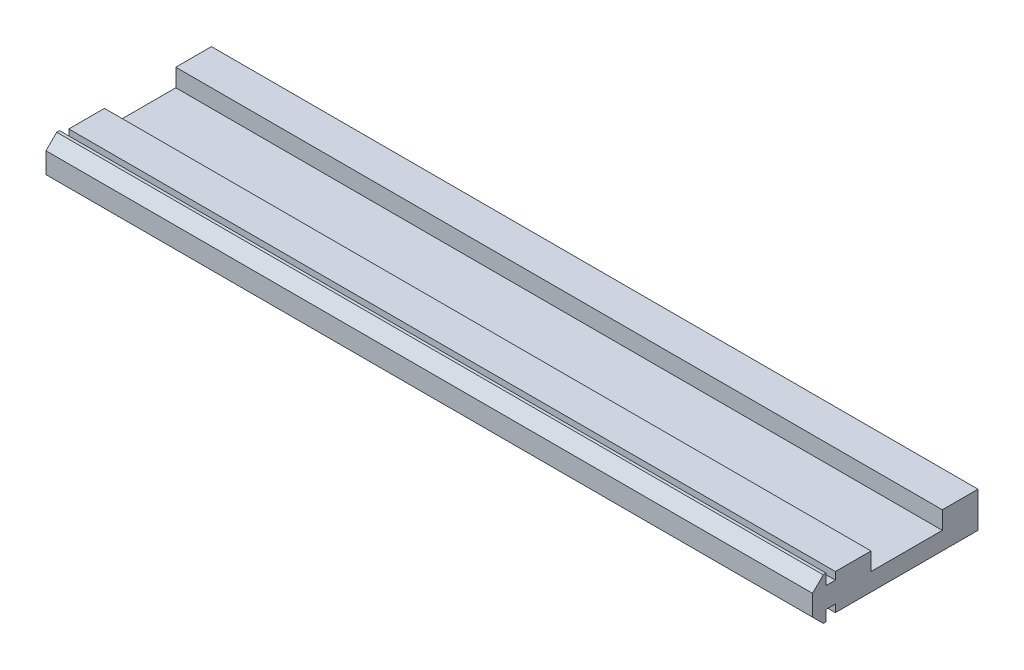
ISO-10303-21;
HEADER;
FILE_DESCRIPTION(('STEP AP214'),'2;1');
FILE_NAME('part.step','',(''),(''),'','','');
FILE_SCHEMA(('AUTOMOTIVE_DESIGN { 1 0 10303 214 1 1 1 1 }'));
ENDSEC;
DATA;
#1=APPLICATION_CONTEXT('core data for automotive mechanical design processes');
#2=APPLICATION_PROTOCOL_DEFINITION('international standard','automotive_design',2000,#1);
#3=PRODUCT_CONTEXT('',#1,'mechanical');
#4=PRODUCT('Part','Part','',(#3));
#5=PRODUCT_RELATED_PRODUCT_CATEGORY('part','',(#4));
#6=PRODUCT_DEFINITION_FORMATION('','',#4);
#7=PRODUCT_DEFINITION_CONTEXT('part definition',#1,'design');
#8=PRODUCT_DEFINITION('design','',#6,#7);
#9=PRODUCT_DEFINITION_SHAPE('','',#8);
#10=(LENGTH_UNIT() NAMED_UNIT(*) SI_UNIT(.MILLI.,.METRE.));
#11=(NAMED_UNIT(*) PLANE_ANGLE_UNIT() SI_UNIT($,.RADIAN.));
#12=(NAMED_UNIT(*) SI_UNIT($,.STERADIAN.) SOLID_ANGLE_UNIT());
#13=UNCERTAINTY_MEASURE_WITH_UNIT(LENGTH_MEASURE(1.E-05),#10,'distance_accuracy_value','');
#14=(GEOMETRIC_REPRESENTATION_CONTEXT(3) GLOBAL_UNCERTAINTY_ASSIGNED_CONTEXT((#13)) GLOBAL_UNIT_ASSIGNED_CONTEXT((#10,
#11,#12)) REPRESENTATION_CONTEXT('',''));
#15=CARTESIAN_POINT('',(0.,0.,0.));
#16=DIRECTION('',(0.,0.,1.));
#17=DIRECTION('',(1.,0.,0.));
#18=AXIS2_PLACEMENT_3D('',#15,#16,#17);
#19=CARTESIAN_POINT('',(925.,0.,90.1082240909334));
#20=DIRECTION('',(0.,0.,-1.));
#21=DIRECTION('',(-1.,0.,0.));
#22=AXIS2_PLACEMENT_3D('',#19,#20,#21);
#23=PLANE('',#22);
#24=DIRECTION('',(-1.,0.,0.));
#25=VECTOR('',#24,1.);
#26=CARTESIAN_POINT('',(925.,-5.00000000000001,90.1082240909334));
#27=LINE('',#26,#25);
#28=CARTESIAN_POINT('',(925.,-5.00000000000001,90.1082240909334));
#29=VERTEX_POINT('',#28);
#30=CARTESIAN_POINT('',(710.,-5.00000000000001,90.1082240909334));
#31=VERTEX_POINT('',#30);
#32=EDGE_CURVE('E245',#29,#31,#27,.T.);
#33=ORIENTED_EDGE('',*,*,#32,.T.);
#34=DIRECTION('',(0.,1.,0.));
#35=VECTOR('',#34,1.);
#36=CARTESIAN_POINT('',(710.,0.,90.1082240909334));
#37=LINE('',#36,#35);
#38=CARTESIAN_POINT('',(710.,4.99999999999999,90.1082240909334));
#39=VERTEX_POINT('',#38);
#40=EDGE_CURVE('E202',#31,#39,#37,.T.);
#41=ORIENTED_EDGE('',*,*,#40,.T.);
#42=DIRECTION('',(-1.,0.,0.));
#43=VECTOR('',#42,1.);
#44=CARTESIAN_POINT('',(925.,4.99999999999999,90.1082240909334));
#45=LINE('',#44,#43);
#46=CARTESIAN_POINT('',(925.,4.99999999999999,90.1082240909334));
#47=VERTEX_POINT('',#46);
#48=EDGE_CURVE('E50',#47,#39,#45,.T.);
#49=ORIENTED_EDGE('',*,*,#48,.F.);
#50=DIRECTION('',(0.,-1.,0.));
#51=VECTOR('',#50,1.);
#52=CARTESIAN_POINT('',(925.,0.,90.1082240909334));
#53=LINE('',#52,#51);
#54=EDGE_CURVE('E221',#47,#29,#53,.T.);
#55=ORIENTED_EDGE('',*,*,#54,.T.);
#56=EDGE_LOOP('',(#33,#41,#49,#55));
#57=FACE_BOUND('',#56,.T.);
#58=ADVANCED_FACE('F43',(#57),#23,.T.);
#59=CARTESIAN_POINT('',(925.,4.99999999999999,0.));
#60=DIRECTION('',(0.,1.,0.));
#61=DIRECTION('',(0.,0.,1.));
#62=AXIS2_PLACEMENT_3D('',#59,#60,#61);
#63=PLANE('',#62);
#64=ORIENTED_EDGE('',*,*,#48,.T.);
#65=DIRECTION('',(0.,0.,1.));
#66=VECTOR('',#65,1.);
#67=CARTESIAN_POINT('',(710.,4.99999999999999,0.));
#68=LINE('',#67,#66);
#69=CARTESIAN_POINT('',(710.,4.99999999999999,100.108224090933));
#70=VERTEX_POINT('',#69);
#71=EDGE_CURVE('E218',#39,#70,#68,.T.);
#72=ORIENTED_EDGE('',*,*,#71,.T.);
#73=DIRECTION('',(-1.,0.,0.));
#74=VECTOR('',#73,1.);
#75=CARTESIAN_POINT('',(925.,4.99999999999999,100.108224090933));
#76=LINE('',#75,#74);
#77=CARTESIAN_POINT('',(925.,4.99999999999999,100.108224090933));
#78=VERTEX_POINT('',#77);
#79=EDGE_CURVE('E263',#78,#70,#76,.T.);
#80=ORIENTED_EDGE('',*,*,#79,.F.);
#81=DIRECTION('',(0.,0.,-1.));
#82=VECTOR('',#81,1.);
#83=CARTESIAN_POINT('',(925.,4.99999999999999,0.));
#84=LINE('',#83,#82);
#85=EDGE_CURVE('E224',#78,#47,#84,.T.);
#86=ORIENTED_EDGE('',*,*,#85,.T.);
#87=EDGE_LOOP('',(#64,#72,#80,#86));
#88=FACE_BOUND('',#87,.T.);
#89=ADVANCED_FACE('F267',(#88),#63,.T.);
#90=CARTESIAN_POINT('',(925.,0.,100.108224090933));
#91=DIRECTION('',(0.,0.,1.));
#92=DIRECTION('',(1.,0.,0.));
#93=AXIS2_PLACEMENT_3D('',#90,#91,#92);
#94=PLANE('',#93);
#95=ORIENTED_EDGE('',*,*,#79,.T.);
#96=DIRECTION('',(0.,-1.,0.));
#97=VECTOR('',#96,1.);
#98=CARTESIAN_POINT('',(710.,0.,100.108224090933));
#99=LINE('',#98,#97);
#100=CARTESIAN_POINT('',(710.,0.,100.108224090933));
#101=VERTEX_POINT('',#100);
#102=EDGE_CURVE('E215',#70,#101,#99,.T.);
#103=ORIENTED_EDGE('',*,*,#102,.T.);
#104=DIRECTION('',(-1.,0.,0.));
#105=VECTOR('',#104,1.);
#106=CARTESIAN_POINT('',(925.,0.,100.108224090933));
#107=LINE('',#106,#105);
#108=CARTESIAN_POINT('',(925.,0.,100.108224090933));
#109=VERTEX_POINT('',#108);
#110=EDGE_CURVE('E260',#109,#101,#107,.T.);
#111=ORIENTED_EDGE('',*,*,#110,.F.);
#112=DIRECTION('',(0.,1.,0.));
#113=VECTOR('',#112,1.);
#114=CARTESIAN_POINT('',(925.,0.,100.108224090933));
#115=LINE('',#114,#113);
#116=EDGE_CURVE('E227',#109,#78,#115,.T.);
#117=ORIENTED_EDGE('',*,*,#116,.T.);
#118=EDGE_LOOP('',(#95,#103,#111,#117));
#119=FACE_BOUND('',#118,.T.);
#120=ADVANCED_FACE('F281',(#119),#94,.T.);
#121=CARTESIAN_POINT('',(925.,0.,0.));
#122=DIRECTION('',(0.,1.,0.));
#123=DIRECTION('',(0.,0.,1.));
#124=AXIS2_PLACEMENT_3D('',#121,#122,#123);
#125=PLANE('',#124);
#126=ORIENTED_EDGE('',*,*,#110,.T.);
#127=DIRECTION('',(0.,0.,1.));
#128=VECTOR('',#127,1.);
#129=CARTESIAN_POINT('',(710.,0.,0.));
#130=LINE('',#129,#128);
#131=CARTESIAN_POINT('',(710.,0.,120.108224090933));
#132=VERTEX_POINT('',#131);
#133=EDGE_CURVE('E212',#101,#132,#130,.T.);
#134=ORIENTED_EDGE('',*,*,#133,.T.);
#135=DIRECTION('',(-1.,0.,0.));
#136=VECTOR('',#135,1.);
#137=CARTESIAN_POINT('',(925.,0.,120.108224090933));
#138=LINE('',#137,#136);
#139=CARTESIAN_POINT('',(925.,0.,120.108224090933));
#140=VERTEX_POINT('',#139);
#141=EDGE_CURVE('E257',#140,#132,#138,.T.);
#142=ORIENTED_EDGE('',*,*,#141,.F.);
#143=DIRECTION('',(0.,0.,-1.));
#144=VECTOR('',#143,1.);
#145=CARTESIAN_POINT('',(925.,0.,0.));
#146=LINE('',#145,#144);
#147=EDGE_CURVE('E230',#140,#109,#146,.T.);
#148=ORIENTED_EDGE('',*,*,#147,.T.);
#149=EDGE_LOOP('',(#126,#134,#142,#148));
#150=FACE_BOUND('',#149,.T.);
#151=ADVANCED_FACE('F283',(#150),#125,.T.);
#152=CARTESIAN_POINT('',(925.,0.,120.108224090933));
#153=DIRECTION('',(0.,0.,-1.));
#154=DIRECTION('',(-1.,0.,0.));
#155=AXIS2_PLACEMENT_3D('',#152,#153,#154);
#156=PLANE('',#155);
#157=ORIENTED_EDGE('',*,*,#141,.T.);
#158=DIRECTION('',(0.,1.,0.));
#159=VECTOR('',#158,1.);
#160=CARTESIAN_POINT('',(710.,0.,120.108224090933));
#161=LINE('',#160,#159);
#162=CARTESIAN_POINT('',(710.,5.,120.108224090933));
#163=VERTEX_POINT('',#162);
#164=EDGE_CURVE('E209',#132,#163,#161,.T.);
#165=ORIENTED_EDGE('',*,*,#164,.T.);
#166=DIRECTION('',(-1.,0.,0.));
#167=VECTOR('',#166,1.);
#168=CARTESIAN_POINT('',(925.,5.,120.108224090933));
#169=LINE('',#168,#167);
#170=CARTESIAN_POINT('',(925.,5.,120.108224090933));
#171=VERTEX_POINT('',#170);
#172=EDGE_CURVE('E254',#171,#163,#169,.T.);
#173=ORIENTED_EDGE('',*,*,#172,.F.);
#174=DIRECTION('',(0.,-1.,0.));
#175=VECTOR('',#174,1.);
#176=CARTESIAN_POINT('',(925.,0.,120.108224090933));
#177=LINE('',#176,#175);
#178=EDGE_CURVE('E233',#171,#140,#177,.T.);
#179=ORIENTED_EDGE('',*,*,#178,.T.);
#180=EDGE_LOOP('',(#157,#165,#173,#179));
#181=FACE_BOUND('',#180,.T.);
#182=ADVANCED_FACE('F288',(#181),#156,.T.);
#183=CARTESIAN_POINT('',(925.,5.,0.));
#184=DIRECTION('',(0.,1.,0.));
#185=DIRECTION('',(0.,0.,1.));
#186=AXIS2_PLACEMENT_3D('',#183,#184,#185);
#187=PLANE('',#186);
#188=ORIENTED_EDGE('',*,*,#172,.T.);
#189=DIRECTION('',(0.,0.,1.));
#190=VECTOR('',#189,1.);
#191=CARTESIAN_POINT('',(710.,5.,0.));
#192=LINE('',#191,#190);
#193=CARTESIAN_POINT('',(710.,5.,130.108224090933));
#194=VERTEX_POINT('',#193);
#195=EDGE_CURVE('E206',#163,#194,#192,.T.);
#196=ORIENTED_EDGE('',*,*,#195,.T.);
#197=DIRECTION('',(-1.,0.,0.));
#198=VECTOR('',#197,1.);
#199=CARTESIAN_POINT('',(925.,5.,130.108224090933));
#200=LINE('',#199,#198);
#201=CARTESIAN_POINT('',(925.,5.,130.108224090933));
#202=VERTEX_POINT('',#201);
#203=EDGE_CURVE('E251',#202,#194,#200,.T.);
#204=ORIENTED_EDGE('',*,*,#203,.F.);
#205=DIRECTION('',(0.,0.,-1.));
#206=VECTOR('',#205,1.);
#207=CARTESIAN_POINT('',(925.,5.,0.));
#208=LINE('',#207,#206);
#209=EDGE_CURVE('E236',#202,#171,#208,.T.);
#210=ORIENTED_EDGE('',*,*,#209,.T.);
#211=EDGE_LOOP('',(#188,#196,#204,#210));
#212=FACE_BOUND('',#211,.T.);
#213=ADVANCED_FACE('F290',(#212),#187,.T.);
#214=CARTESIAN_POINT('',(925.,0.,130.108224090933));
#215=DIRECTION('',(0.,0.,1.));
#216=DIRECTION('',(1.,0.,0.));
#217=AXIS2_PLACEMENT_3D('',#214,#215,#216);
#218=PLANE('',#217);
#219=DIRECTION('',(-1.,0.,0.));
#220=VECTOR('',#219,1.);
#221=CARTESIAN_POINT('',(925.,2.9,130.108224090933));
#222=LINE('',#221,#220);
#223=CARTESIAN_POINT('',(925.,2.9,130.108224090933));
#224=VERTEX_POINT('',#223);
#225=CARTESIAN_POINT('',(710.,2.9,130.108224090933));
#226=VERTEX_POINT('',#225);
#227=EDGE_CURVE('E65',#224,#226,#222,.T.);
#228=ORIENTED_EDGE('',*,*,#227,.F.);
#229=DIRECTION('',(0.,1.,0.));
#230=VECTOR('',#229,1.);
#231=CARTESIAN_POINT('',(925.,0.,130.108224090933));
#232=LINE('',#231,#230);
#233=EDGE_CURVE('E239',#224,#202,#232,.T.);
#234=ORIENTED_EDGE('',*,*,#233,.T.);
#235=ORIENTED_EDGE('',*,*,#203,.T.);
#236=DIRECTION('',(0.,-1.,0.));
#237=VECTOR('',#236,1.);
#238=CARTESIAN_POINT('',(710.,0.,130.108224090933));
#239=LINE('',#238,#237);
#240=EDGE_CURVE('E203',#194,#226,#239,.T.);
#241=ORIENTED_EDGE('',*,*,#240,.T.);
#242=EDGE_LOOP('',(#228,#234,#235,#241));
#243=FACE_BOUND('',#242,.T.);
#244=ADVANCED_FACE('F292',(#243),#218,.T.);
#245=DIRECTION('',(1.,0.,0.));
#246=VECTOR('',#245,1.);
#247=CARTESIAN_POINT('',(925.,-2.9,130.108224090933));
#248=LINE('',#247,#246);
#249=CARTESIAN_POINT('',(710.,-2.9,130.108224090933));
#250=VERTEX_POINT('',#249);
#251=CARTESIAN_POINT('',(925.,-2.9,130.108224090933));
#252=VERTEX_POINT('',#251);
#253=EDGE_CURVE('E197',#250,#252,#248,.T.);
#254=ORIENTED_EDGE('',*,*,#253,.F.);
#255=CARTESIAN_POINT('',(710.,-5.,130.108224090933));
#256=VERTEX_POINT('',#255);
#257=EDGE_CURVE('E200',#250,#256,#239,.T.);
#258=ORIENTED_EDGE('',*,*,#257,.T.);
#259=DIRECTION('',(-1.,0.,0.));
#260=VECTOR('',#259,1.);
#261=CARTESIAN_POINT('',(925.,-5.,130.108224090933));
#262=LINE('',#261,#260);
#263=CARTESIAN_POINT('',(925.,-5.,130.108224090933));
#264=VERTEX_POINT('',#263);
#265=EDGE_CURVE('E248',#264,#256,#262,.T.);
#266=ORIENTED_EDGE('',*,*,#265,.F.);
#267=DIRECTION('',(0.,1.,0.));
#268=VECTOR('',#267,1.);
#269=CARTESIAN_POINT('',(925.,0.,130.108224090933));
#270=LINE('',#269,#268);
#271=EDGE_CURVE('E57',#264,#252,#270,.T.);
#272=ORIENTED_EDGE('',*,*,#271,.T.);
#273=EDGE_LOOP('',(#254,#258,#266,#272));
#274=FACE_BOUND('',#273,.T.);
#275=ADVANCED_FACE('F294',(#274),#218,.T.);
#276=CARTESIAN_POINT('',(925.,-5.00000000000002,0.));
#277=DIRECTION('',(0.,-1.,0.));
#278=DIRECTION('',(0.,0.,-1.));
#279=AXIS2_PLACEMENT_3D('',#276,#277,#278);
#280=PLANE('',#279);
#281=ORIENTED_EDGE('',*,*,#265,.T.);
#282=DIRECTION('',(0.,0.,-1.));
#283=VECTOR('',#282,1.);
#284=CARTESIAN_POINT('',(710.,-5.00000000000002,0.));
#285=LINE('',#284,#283);
#286=EDGE_CURVE('E11',#256,#31,#285,.T.);
#287=ORIENTED_EDGE('',*,*,#286,.T.);
#288=ORIENTED_EDGE('',*,*,#32,.F.);
#289=DIRECTION('',(0.,0.,1.));
#290=VECTOR('',#289,1.);
#291=CARTESIAN_POINT('',(925.,-5.00000000000002,0.));
#292=LINE('',#291,#290);
#293=EDGE_CURVE('E242',#29,#264,#292,.T.);
#294=ORIENTED_EDGE('',*,*,#293,.T.);
#295=EDGE_LOOP('',(#281,#287,#288,#294));
#296=FACE_BOUND('',#295,.T.);
#297=ADVANCED_FACE('F277',(#296),#280,.T.);
#298=CARTESIAN_POINT('',(925.,0.,0.));
#299=DIRECTION('',(1.,0.,0.));
#300=DIRECTION('',(0.,0.,-1.));
#301=AXIS2_PLACEMENT_3D('',#298,#299,#300);
#302=PLANE('',#301);
#303=ORIENTED_EDGE('',*,*,#233,.F.);
#304=DIRECTION('',(0.,0.,1.));
#305=VECTOR('',#304,1.);
#306=CARTESIAN_POINT('',(925.,2.9,129.908224090933));
#307=LINE('',#306,#305);
#308=CARTESIAN_POINT('',(925.,2.9,132.708224090933));
#309=VERTEX_POINT('',#308);
#310=EDGE_CURVE('E190',#224,#309,#307,.T.);
#311=ORIENTED_EDGE('',*,*,#310,.T.);
#312=DIRECTION('',(0.,1.,0.));
#313=VECTOR('',#312,1.);
#314=CARTESIAN_POINT('',(925.,2.9,132.708224090933));
#315=LINE('',#314,#313);
#316=CARTESIAN_POINT('',(925.,5.9,132.708224090933));
#317=VERTEX_POINT('',#316);
#318=EDGE_CURVE('E189',#309,#317,#315,.T.);
#319=ORIENTED_EDGE('',*,*,#318,.T.);
#320=DIRECTION('',(0.,0.,1.));
#321=VECTOR('',#320,1.);
#322=CARTESIAN_POINT('',(925.,5.9,132.708224090933));
#323=LINE('',#322,#321);
#324=CARTESIAN_POINT('',(925.,5.9,133.506142562916));
#325=VERTEX_POINT('',#324);
#326=EDGE_CURVE('E565',#317,#325,#323,.T.);
#327=ORIENTED_EDGE('',*,*,#326,.T.);
#328=DIRECTION('',(0.,-0.707106781186545,0.70710678118655));
#329=VECTOR('',#328,1.);
#330=CARTESIAN_POINT('',(925.,5.9,133.506142562916));
#331=LINE('',#330,#329);
#332=CARTESIAN_POINT('',(925.,2.89791847198288,136.508224090933));
#333=VERTEX_POINT('',#332);
#334=EDGE_CURVE('E569',#325,#333,#331,.T.);
#335=ORIENTED_EDGE('',*,*,#334,.T.);
#336=DIRECTION('',(0.,-1.,0.));
#337=VECTOR('',#336,1.);
#338=CARTESIAN_POINT('',(925.,2.89791847198288,136.508224090933));
#339=LINE('',#338,#337);
#340=CARTESIAN_POINT('',(925.,-2.89791847198287,136.508224090933));
#341=VERTEX_POINT('',#340);
#342=EDGE_CURVE('E604',#333,#341,#339,.T.);
#343=ORIENTED_EDGE('',*,*,#342,.T.);
#344=DIRECTION('',(0.,-0.707106781186548,-0.707106781186547));
#345=VECTOR('',#344,1.);
#346=CARTESIAN_POINT('',(925.,-2.89791847198287,136.508224090933));
#347=LINE('',#346,#345);
#348=CARTESIAN_POINT('',(925.,-5.9,133.506142562916));
#349=VERTEX_POINT('',#348);
#350=EDGE_CURVE('E608',#341,#349,#347,.T.);
#351=ORIENTED_EDGE('',*,*,#350,.T.);
#352=DIRECTION('',(0.,0.,-1.));
#353=VECTOR('',#352,1.);
#354=CARTESIAN_POINT('',(925.,-5.9,133.506142562916));
#355=LINE('',#354,#353);
#356=CARTESIAN_POINT('',(925.,-5.9,132.708224090933));
#357=VERTEX_POINT('',#356);
#358=EDGE_CURVE('E612',#349,#357,#355,.T.);
#359=ORIENTED_EDGE('',*,*,#358,.T.);
#360=DIRECTION('',(0.,1.,0.));
#361=VECTOR('',#360,1.);
#362=CARTESIAN_POINT('',(925.,-5.9,132.708224090933));
#363=LINE('',#362,#361);
#364=CARTESIAN_POINT('',(925.,-2.9,132.708224090933));
#365=VERTEX_POINT('',#364);
#366=EDGE_CURVE('E615',#357,#365,#363,.T.);
#367=ORIENTED_EDGE('',*,*,#366,.T.);
#368=DIRECTION('',(0.,0.,-1.));
#369=VECTOR('',#368,1.);
#370=CARTESIAN_POINT('',(925.,-2.9,132.708224090933));
#371=LINE('',#370,#369);
#372=EDGE_CURVE('E198',#365,#252,#371,.T.);
#373=ORIENTED_EDGE('',*,*,#372,.T.);
#374=ORIENTED_EDGE('',*,*,#271,.F.);
#375=ORIENTED_EDGE('',*,*,#293,.F.);
#376=ORIENTED_EDGE('',*,*,#54,.F.);
#377=ORIENTED_EDGE('',*,*,#85,.F.);
#378=ORIENTED_EDGE('',*,*,#116,.F.);
#379=ORIENTED_EDGE('',*,*,#147,.F.);
#380=ORIENTED_EDGE('',*,*,#178,.F.);
#381=ORIENTED_EDGE('',*,*,#209,.F.);
#382=EDGE_LOOP('',(#303,#311,#319,#327,#335,#343,#351,#359,#367,#373,#374,#375,#376,#377,#378,
#379,#380,#381));
#383=FACE_BOUND('',#382,.T.);
#384=ADVANCED_FACE('F273',(#383),#302,.T.);
#385=CARTESIAN_POINT('',(710.,0.,0.));
#386=DIRECTION('',(-1.,0.,0.));
#387=DIRECTION('',(0.,0.,1.));
#388=AXIS2_PLACEMENT_3D('',#385,#386,#387);
#389=PLANE('',#388);
#390=ORIENTED_EDGE('',*,*,#257,.F.);
#391=DIRECTION('',(0.,0.,-1.));
#392=VECTOR('',#391,1.);
#393=CARTESIAN_POINT('',(710.,-2.9,132.708224090933));
#394=LINE('',#393,#392);
#395=CARTESIAN_POINT('',(710.,-2.9,132.708224090933));
#396=VERTEX_POINT('',#395);
#397=EDGE_CURVE('E574',#396,#250,#394,.T.);
#398=ORIENTED_EDGE('',*,*,#397,.F.);
#399=DIRECTION('',(0.,1.,0.));
#400=VECTOR('',#399,1.);
#401=CARTESIAN_POINT('',(710.,-5.9,132.708224090933));
#402=LINE('',#401,#400);
#403=CARTESIAN_POINT('',(710.,-5.9,132.708224090933));
#404=VERTEX_POINT('',#403);
#405=EDGE_CURVE('E576',#404,#396,#402,.T.);
#406=ORIENTED_EDGE('',*,*,#405,.F.);
#407=DIRECTION('',(0.,0.,-1.));
#408=VECTOR('',#407,1.);
#409=CARTESIAN_POINT('',(710.,-5.9,133.506142562916));
#410=LINE('',#409,#408);
#411=CARTESIAN_POINT('',(710.,-5.9,133.506142562916));
#412=VERTEX_POINT('',#411);
#413=EDGE_CURVE('E580',#412,#404,#410,.T.);
#414=ORIENTED_EDGE('',*,*,#413,.F.);
#415=DIRECTION('',(0.,-0.707106781186548,-0.707106781186547));
#416=VECTOR('',#415,1.);
#417=CARTESIAN_POINT('',(710.,-2.89791847198287,136.508224090933));
#418=LINE('',#417,#416);
#419=CARTESIAN_POINT('',(710.,-2.89791847198287,136.508224090933));
#420=VERTEX_POINT('',#419);
#421=EDGE_CURVE('E584',#420,#412,#418,.T.);
#422=ORIENTED_EDGE('',*,*,#421,.F.);
#423=DIRECTION('',(0.,-1.,0.));
#424=VECTOR('',#423,1.);
#425=CARTESIAN_POINT('',(710.,2.89791847198288,136.508224090933));
#426=LINE('',#425,#424);
#427=CARTESIAN_POINT('',(710.,2.89791847198288,136.508224090933));
#428=VERTEX_POINT('',#427);
#429=EDGE_CURVE('E588',#428,#420,#426,.T.);
#430=ORIENTED_EDGE('',*,*,#429,.F.);
#431=DIRECTION('',(0.,-0.707106781186545,0.70710678118655));
#432=VECTOR('',#431,1.);
#433=CARTESIAN_POINT('',(710.,5.9,133.506142562916));
#434=LINE('',#433,#432);
#435=CARTESIAN_POINT('',(710.,5.9,133.506142562916));
#436=VERTEX_POINT('',#435);
#437=EDGE_CURVE('E592',#436,#428,#434,.T.);
#438=ORIENTED_EDGE('',*,*,#437,.F.);
#439=DIRECTION('',(0.,0.,1.));
#440=VECTOR('',#439,1.);
#441=CARTESIAN_POINT('',(710.,5.9,132.708224090933));
#442=LINE('',#441,#440);
#443=CARTESIAN_POINT('',(710.,5.9,132.708224090933));
#444=VERTEX_POINT('',#443);
#445=EDGE_CURVE('E182',#444,#436,#442,.T.);
#446=ORIENTED_EDGE('',*,*,#445,.F.);
#447=DIRECTION('',(0.,1.,0.));
#448=VECTOR('',#447,1.);
#449=CARTESIAN_POINT('',(710.,2.9,132.708224090933));
#450=LINE('',#449,#448);
#451=CARTESIAN_POINT('',(710.,2.9,132.708224090933));
#452=VERTEX_POINT('',#451);
#453=EDGE_CURVE('E178',#452,#444,#450,.T.);
#454=ORIENTED_EDGE('',*,*,#453,.F.);
#455=DIRECTION('',(0.,0.,1.));
#456=VECTOR('',#455,1.);
#457=CARTESIAN_POINT('',(710.,2.9,129.908224090933));
#458=LINE('',#457,#456);
#459=EDGE_CURVE('E167',#226,#452,#458,.T.);
#460=ORIENTED_EDGE('',*,*,#459,.F.);
#461=ORIENTED_EDGE('',*,*,#240,.F.);
#462=ORIENTED_EDGE('',*,*,#195,.F.);
#463=ORIENTED_EDGE('',*,*,#164,.F.);
#464=ORIENTED_EDGE('',*,*,#133,.F.);
#465=ORIENTED_EDGE('',*,*,#102,.F.);
#466=ORIENTED_EDGE('',*,*,#71,.F.);
#467=ORIENTED_EDGE('',*,*,#40,.F.);
#468=ORIENTED_EDGE('',*,*,#286,.F.);
#469=EDGE_LOOP('',(#390,#398,#406,#414,#422,#430,#438,#446,#454,#460,#461,#462,#463,#464,#465,
#466,#467,#468));
#470=FACE_BOUND('',#469,.T.);
#471=ADVANCED_FACE('F180',(#470),#389,.T.);
#472=CARTESIAN_POINT('',(696.479644975075,-2.9,132.708224090933));
#473=DIRECTION('',(0.,-1.,0.));
#474=DIRECTION('',(0.,0.,-1.));
#475=AXIS2_PLACEMENT_3D('',#472,#473,#474);
#476=PLANE('',#475);
#477=ORIENTED_EDGE('',*,*,#397,.T.);
#478=ORIENTED_EDGE('',*,*,#253,.T.);
#479=ORIENTED_EDGE('',*,*,#372,.F.);
#480=DIRECTION('',(1.,0.,0.));
#481=VECTOR('',#480,1.);
#482=CARTESIAN_POINT('',(696.479644975075,-2.9,132.708224090933));
#483=LINE('',#482,#481);
#484=EDGE_CURVE('E579',#396,#365,#483,.T.);
#485=ORIENTED_EDGE('',*,*,#484,.F.);
#486=EDGE_LOOP('',(#477,#478,#479,#485));
#487=FACE_BOUND('',#486,.T.);
#488=ADVANCED_FACE('F356',(#487),#476,.T.);
#489=CARTESIAN_POINT('',(696.479644975075,-5.9,132.708224090933));
#490=DIRECTION('',(0.,0.,-1.));
#491=DIRECTION('',(-1.,0.,0.));
#492=AXIS2_PLACEMENT_3D('',#489,#490,#491);
#493=PLANE('',#492);
#494=DIRECTION('',(1.,0.,0.));
#495=VECTOR('',#494,1.);
#496=CARTESIAN_POINT('',(696.479644975075,-5.9,132.708224090933));
#497=LINE('',#496,#495);
#498=EDGE_CURVE('E583',#404,#357,#497,.T.);
#499=ORIENTED_EDGE('',*,*,#498,.F.);
#500=ORIENTED_EDGE('',*,*,#405,.T.);
#501=ORIENTED_EDGE('',*,*,#484,.T.);
#502=ORIENTED_EDGE('',*,*,#366,.F.);
#503=EDGE_LOOP('',(#499,#500,#501,#502));
#504=FACE_BOUND('',#503,.T.);
#505=ADVANCED_FACE('F365',(#504),#493,.T.);
#506=CARTESIAN_POINT('',(696.479644975075,-5.9,133.506142562916));
#507=DIRECTION('',(0.,-1.,0.));
#508=DIRECTION('',(0.,0.,-1.));
#509=AXIS2_PLACEMENT_3D('',#506,#507,#508);
#510=PLANE('',#509);
#511=DIRECTION('',(1.,0.,0.));
#512=VECTOR('',#511,1.);
#513=CARTESIAN_POINT('',(696.479644975075,-5.9,133.506142562916));
#514=LINE('',#513,#512);
#515=EDGE_CURVE('E587',#412,#349,#514,.T.);
#516=ORIENTED_EDGE('',*,*,#515,.F.);
#517=ORIENTED_EDGE('',*,*,#413,.T.);
#518=ORIENTED_EDGE('',*,*,#498,.T.);
#519=ORIENTED_EDGE('',*,*,#358,.F.);
#520=EDGE_LOOP('',(#516,#517,#518,#519));
#521=FACE_BOUND('',#520,.T.);
#522=ADVANCED_FACE('F375',(#521),#510,.T.);
#523=CARTESIAN_POINT('',(696.479644975075,-2.89791847198287,136.508224090933));
#524=DIRECTION('',(0.,-0.707106781186547,0.707106781186548));
#525=DIRECTION('',(0.,-0.707106781186548,-0.707106781186547));
#526=AXIS2_PLACEMENT_3D('',#523,#524,#525);
#527=PLANE('',#526);
#528=DIRECTION('',(1.,0.,0.));
#529=VECTOR('',#528,1.);
#530=CARTESIAN_POINT('',(696.479644975075,-2.89791847198287,136.508224090933));
#531=LINE('',#530,#529);
#532=EDGE_CURVE('E591',#420,#341,#531,.T.);
#533=ORIENTED_EDGE('',*,*,#532,.F.);
#534=ORIENTED_EDGE('',*,*,#421,.T.);
#535=ORIENTED_EDGE('',*,*,#515,.T.);
#536=ORIENTED_EDGE('',*,*,#350,.F.);
#537=EDGE_LOOP('',(#533,#534,#535,#536));
#538=FACE_BOUND('',#537,.T.);
#539=ADVANCED_FACE('F385',(#538),#527,.T.);
#540=CARTESIAN_POINT('',(696.479644975075,2.89791847198288,136.508224090933));
#541=DIRECTION('',(0.,0.,1.));
#542=DIRECTION('',(1.,0.,0.));
#543=AXIS2_PLACEMENT_3D('',#540,#541,#542);
#544=PLANE('',#543);
#545=DIRECTION('',(1.,0.,0.));
#546=VECTOR('',#545,1.);
#547=CARTESIAN_POINT('',(696.479644975075,2.89791847198288,136.508224090933));
#548=LINE('',#547,#546);
#549=EDGE_CURVE('E595',#428,#333,#548,.T.);
#550=ORIENTED_EDGE('',*,*,#549,.F.);
#551=ORIENTED_EDGE('',*,*,#429,.T.);
#552=ORIENTED_EDGE('',*,*,#532,.T.);
#553=ORIENTED_EDGE('',*,*,#342,.F.);
#554=EDGE_LOOP('',(#550,#551,#552,#553));
#555=FACE_BOUND('',#554,.T.);
#556=ADVANCED_FACE('F395',(#555),#544,.T.);
#557=CARTESIAN_POINT('',(696.479644975075,5.9,133.506142562916));
#558=DIRECTION('',(0.,0.70710678118655,0.707106781186545));
#559=DIRECTION('',(0.,-0.707106781186545,0.70710678118655));
#560=AXIS2_PLACEMENT_3D('',#557,#558,#559);
#561=PLANE('',#560);
#562=DIRECTION('',(1.,0.,0.));
#563=VECTOR('',#562,1.);
#564=CARTESIAN_POINT('',(696.479644975075,5.9,133.506142562916));
#565=LINE('',#564,#563);
#566=EDGE_CURVE('E185',#436,#325,#565,.T.);
#567=ORIENTED_EDGE('',*,*,#566,.F.);
#568=ORIENTED_EDGE('',*,*,#437,.T.);
#569=ORIENTED_EDGE('',*,*,#549,.T.);
#570=ORIENTED_EDGE('',*,*,#334,.F.);
#571=EDGE_LOOP('',(#567,#568,#569,#570));
#572=FACE_BOUND('',#571,.T.);
#573=ADVANCED_FACE('F405',(#572),#561,.T.);
#574=CARTESIAN_POINT('',(696.479644975075,5.9,132.708224090933));
#575=DIRECTION('',(0.,1.,0.));
#576=DIRECTION('',(0.,0.,1.));
#577=AXIS2_PLACEMENT_3D('',#574,#575,#576);
#578=PLANE('',#577);
#579=DIRECTION('',(1.,0.,0.));
#580=VECTOR('',#579,1.);
#581=CARTESIAN_POINT('',(696.479644975075,5.9,132.708224090933));
#582=LINE('',#581,#580);
#583=EDGE_CURVE('E175',#444,#317,#582,.T.);
#584=ORIENTED_EDGE('',*,*,#583,.F.);
#585=ORIENTED_EDGE('',*,*,#445,.T.);
#586=ORIENTED_EDGE('',*,*,#566,.T.);
#587=ORIENTED_EDGE('',*,*,#326,.F.);
#588=EDGE_LOOP('',(#584,#585,#586,#587));
#589=FACE_BOUND('',#588,.T.);
#590=ADVANCED_FACE('F415',(#589),#578,.T.);
#591=CARTESIAN_POINT('',(696.479644975075,2.9,132.708224090933));
#592=DIRECTION('',(0.,0.,-1.));
#593=DIRECTION('',(-1.,0.,0.));
#594=AXIS2_PLACEMENT_3D('',#591,#592,#593);
#595=PLANE('',#594);
#596=DIRECTION('',(1.,0.,0.));
#597=VECTOR('',#596,1.);
#598=CARTESIAN_POINT('',(696.479644975075,2.9,132.708224090933));
#599=LINE('',#598,#597);
#600=EDGE_CURVE('E172',#452,#309,#599,.T.);
#601=ORIENTED_EDGE('',*,*,#600,.F.);
#602=ORIENTED_EDGE('',*,*,#453,.T.);
#603=ORIENTED_EDGE('',*,*,#583,.T.);
#604=ORIENTED_EDGE('',*,*,#318,.F.);
#605=EDGE_LOOP('',(#601,#602,#603,#604));
#606=FACE_BOUND('',#605,.T.);
#607=ADVANCED_FACE('F187',(#606),#595,.T.);
#608=CARTESIAN_POINT('',(696.479644975075,2.9,129.908224090933));
#609=DIRECTION('',(0.,1.,0.));
#610=DIRECTION('',(0.,0.,1.));
#611=AXIS2_PLACEMENT_3D('',#608,#609,#610);
#612=PLANE('',#611);
#613=ORIENTED_EDGE('',*,*,#310,.F.);
#614=ORIENTED_EDGE('',*,*,#227,.T.);
#615=ORIENTED_EDGE('',*,*,#459,.T.);
#616=ORIENTED_EDGE('',*,*,#600,.T.);
#617=EDGE_LOOP('',(#613,#614,#615,#616));
#618=FACE_BOUND('',#617,.T.);
#619=ADVANCED_FACE('F170',(#618),#612,.T.);
#620=CLOSED_SHELL('',(#58,#89,#120,#151,#182,#213,#244,#275,#297,#384,#471,#488,#505,#522,#539,
#556,#573,#590,#607,#619));
#621=MANIFOLD_SOLID_BREP('B2',#620);
#622=ADVANCED_BREP_SHAPE_REPRESENTATION('',(#18,#621),#14);
#623=SHAPE_DEFINITION_REPRESENTATION(#9,#622);
ENDSEC;
END-ISO-10303-21;
